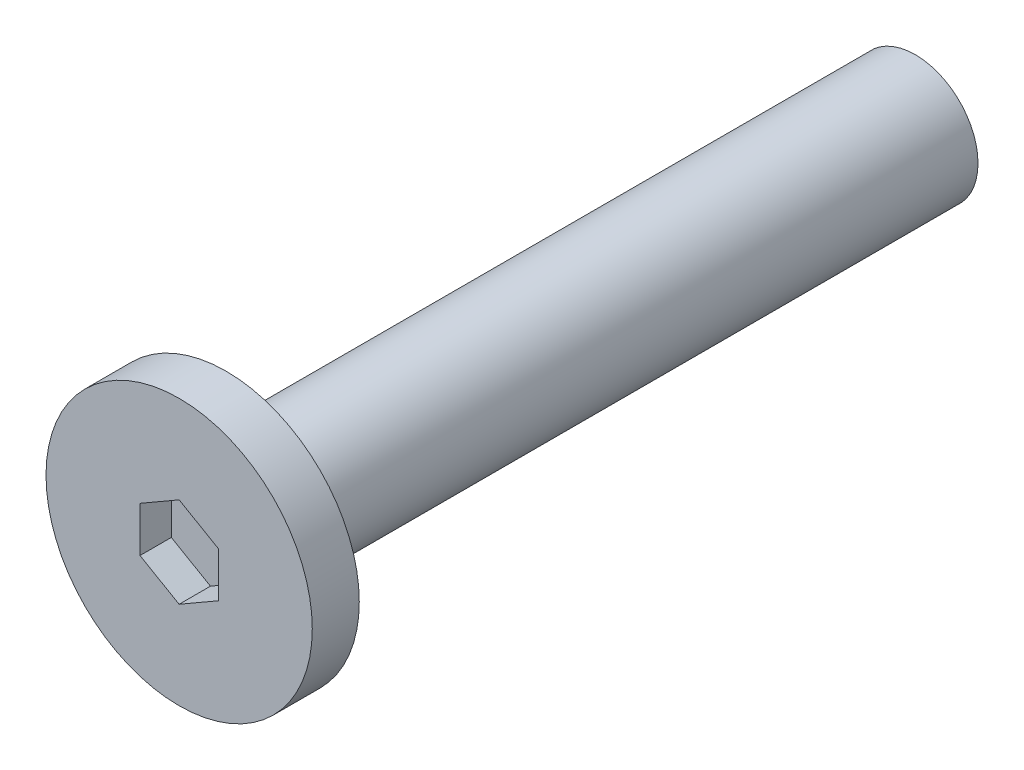
ISO-10303-21;
HEADER;
FILE_DESCRIPTION(('STEP AP214'),'2;1');
FILE_NAME('part.step','',(''),(''),'','','');
FILE_SCHEMA(('AUTOMOTIVE_DESIGN { 1 0 10303 214 1 1 1 1 }'));
ENDSEC;
DATA;
#1=APPLICATION_CONTEXT('core data for automotive mechanical design processes');
#2=APPLICATION_PROTOCOL_DEFINITION('international standard','automotive_design',2000,#1);
#3=PRODUCT_CONTEXT('',#1,'mechanical');
#4=PRODUCT('Part','Part','',(#3));
#5=PRODUCT_RELATED_PRODUCT_CATEGORY('part','',(#4));
#6=PRODUCT_DEFINITION_FORMATION('','',#4);
#7=PRODUCT_DEFINITION_CONTEXT('part definition',#1,'design');
#8=PRODUCT_DEFINITION('design','',#6,#7);
#9=PRODUCT_DEFINITION_SHAPE('','',#8);
#10=(LENGTH_UNIT() NAMED_UNIT(*) SI_UNIT(.MILLI.,.METRE.));
#11=(NAMED_UNIT(*) PLANE_ANGLE_UNIT() SI_UNIT($,.RADIAN.));
#12=(NAMED_UNIT(*) SI_UNIT($,.STERADIAN.) SOLID_ANGLE_UNIT());
#13=UNCERTAINTY_MEASURE_WITH_UNIT(LENGTH_MEASURE(1.E-05),#10,'distance_accuracy_value','');
#14=(GEOMETRIC_REPRESENTATION_CONTEXT(3) GLOBAL_UNCERTAINTY_ASSIGNED_CONTEXT((#13)) GLOBAL_UNIT_ASSIGNED_CONTEXT((#10,
#11,#12)) REPRESENTATION_CONTEXT('',''));
#15=CARTESIAN_POINT('',(0.,0.,0.));
#16=DIRECTION('',(0.,0.,1.));
#17=DIRECTION('',(1.,0.,0.));
#18=AXIS2_PLACEMENT_3D('',#15,#16,#17);
#19=CARTESIAN_POINT('',(21.0196381560285,-172.585838040806,365.074757540733));
#20=DIRECTION('',(0.,0.,1.));
#21=DIRECTION('',(1.,0.,0.));
#22=AXIS2_PLACEMENT_3D('',#19,#20,#21);
#23=PLANE('',#22);
#24=DIRECTION('',(-0.866025403784439,-0.5,0.));
#25=VECTOR('',#24,1.);
#26=CARTESIAN_POINT('',(21.0196381560285,-174.029213713781,365.074757540733));
#27=LINE('',#26,#25);
#28=CARTESIAN_POINT('',(22.2696381560285,-173.307525877294,365.074757540733));
#29=VERTEX_POINT('',#28);
#30=CARTESIAN_POINT('',(21.0196381560285,-174.029213713781,365.074757540733));
#31=VERTEX_POINT('',#30);
#32=EDGE_CURVE('E51',#29,#31,#27,.T.);
#33=ORIENTED_EDGE('',*,*,#32,.F.);
#34=DIRECTION('',(0.,-1.,0.));
#35=VECTOR('',#34,1.);
#36=CARTESIAN_POINT('',(22.2696381560285,-173.307525877294,365.074757540733));
#37=LINE('',#36,#35);
#38=CARTESIAN_POINT('',(22.2696381560285,-171.864150204319,365.074757540733));
#39=VERTEX_POINT('',#38);
#40=EDGE_CURVE('E180',#39,#29,#37,.T.);
#41=ORIENTED_EDGE('',*,*,#40,.F.);
#42=DIRECTION('',(-0.866025403784439,0.5,0.));
#43=VECTOR('',#42,1.);
#44=CARTESIAN_POINT('',(22.2696381560285,-171.864150204319,365.074757540733));
#45=LINE('',#44,#43);
#46=CARTESIAN_POINT('',(21.0196381560285,-171.142462367832,365.074757540733));
#47=VERTEX_POINT('',#46);
#48=EDGE_CURVE('E149',#39,#47,#45,.T.);
#49=ORIENTED_EDGE('',*,*,#48,.T.);
#50=DIRECTION('',(0.866025403784439,0.5,0.));
#51=VECTOR('',#50,1.);
#52=CARTESIAN_POINT('',(21.0196381560285,-171.142462367832,365.074757540733));
#53=LINE('',#52,#51);
#54=CARTESIAN_POINT('',(19.7696381560285,-171.864150204319,365.074757540733));
#55=VERTEX_POINT('',#54);
#56=EDGE_CURVE('E145',#55,#47,#53,.T.);
#57=ORIENTED_EDGE('',*,*,#56,.F.);
#58=DIRECTION('',(0.,-1.,0.));
#59=VECTOR('',#58,1.);
#60=CARTESIAN_POINT('',(19.7696381560285,-171.864150204319,365.074757540733));
#61=LINE('',#60,#59);
#62=CARTESIAN_POINT('',(19.7696381560285,-173.307525877294,365.074757540733));
#63=VERTEX_POINT('',#62);
#64=EDGE_CURVE('E147',#55,#63,#61,.T.);
#65=ORIENTED_EDGE('',*,*,#64,.T.);
#66=DIRECTION('',(-0.866025403784438,0.5,0.));
#67=VECTOR('',#66,1.);
#68=CARTESIAN_POINT('',(19.7696381560285,-173.307525877294,365.074757540733));
#69=LINE('',#68,#67);
#70=EDGE_CURVE('E11',#31,#63,#69,.T.);
#71=ORIENTED_EDGE('',*,*,#70,.F.);
#72=EDGE_LOOP('',(#33,#41,#49,#57,#65,#71));
#73=FACE_BOUND('',#72,.T.);
#74=ADVANCED_FACE('F42',(#73),#23,.T.);
#75=CARTESIAN_POINT('',(19.7696381560285,-173.307525877294,350.874757540733));
#76=DIRECTION('',(0.5,0.866025403784438,0.));
#77=DIRECTION('',(0.,0.,-1.));
#78=AXIS2_PLACEMENT_3D('',#75,#76,#77);
#79=PLANE('',#78);
#80=DIRECTION('',(0.,0.,-1.));
#81=VECTOR('',#80,1.);
#82=CARTESIAN_POINT('',(19.7696381560285,-173.307525877294,350.874757540733));
#83=LINE('',#82,#81);
#84=CARTESIAN_POINT('',(19.7696381560285,-173.307525877294,366.074757540733));
#85=VERTEX_POINT('',#84);
#86=EDGE_CURVE('E136',#85,#63,#83,.T.);
#87=ORIENTED_EDGE('',*,*,#86,.F.);
#88=DIRECTION('',(0.866025403784438,-0.5,0.));
#89=VECTOR('',#88,1.);
#90=CARTESIAN_POINT('',(20.3946381560286,-173.668369795537,366.074757540733));
#91=LINE('',#90,#89);
#92=CARTESIAN_POINT('',(21.0196381560285,-174.029213713781,366.074757540733));
#93=VERTEX_POINT('',#92);
#94=EDGE_CURVE('E184',#85,#93,#91,.T.);
#95=ORIENTED_EDGE('',*,*,#94,.T.);
#96=DIRECTION('',(0.,0.,-1.));
#97=VECTOR('',#96,1.);
#98=CARTESIAN_POINT('',(21.0196381560285,-174.029213713781,350.874757540733));
#99=LINE('',#98,#97);
#100=EDGE_CURVE('E128',#93,#31,#99,.T.);
#101=ORIENTED_EDGE('',*,*,#100,.T.);
#102=ORIENTED_EDGE('',*,*,#70,.T.);
#103=EDGE_LOOP('',(#87,#95,#101,#102));
#104=FACE_BOUND('',#103,.T.);
#105=ADVANCED_FACE('F261',(#104),#79,.T.);
#106=CARTESIAN_POINT('',(21.0196381560285,-174.029213713781,350.874757540733));
#107=DIRECTION('',(-0.5,0.866025403784439,0.));
#108=DIRECTION('',(0.,0.,1.));
#109=AXIS2_PLACEMENT_3D('',#106,#107,#108);
#110=PLANE('',#109);
#111=ORIENTED_EDGE('',*,*,#100,.F.);
#112=DIRECTION('',(0.866025403784439,0.5,0.));
#113=VECTOR('',#112,1.);
#114=CARTESIAN_POINT('',(21.6446381560285,-173.668369795537,366.074757540733));
#115=LINE('',#114,#113);
#116=CARTESIAN_POINT('',(22.2696381560285,-173.307525877294,366.074757540733));
#117=VERTEX_POINT('',#116);
#118=EDGE_CURVE('E194',#93,#117,#115,.T.);
#119=ORIENTED_EDGE('',*,*,#118,.T.);
#120=DIRECTION('',(0.,0.,-1.));
#121=VECTOR('',#120,1.);
#122=CARTESIAN_POINT('',(22.2696381560285,-173.307525877294,350.874757540733));
#123=LINE('',#122,#121);
#124=EDGE_CURVE('E207',#117,#29,#123,.T.);
#125=ORIENTED_EDGE('',*,*,#124,.T.);
#126=ORIENTED_EDGE('',*,*,#32,.T.);
#127=EDGE_LOOP('',(#111,#119,#125,#126));
#128=FACE_BOUND('',#127,.T.);
#129=ADVANCED_FACE('F263',(#128),#110,.T.);
#130=CARTESIAN_POINT('',(22.2696381560285,-173.307525877294,350.874757540733));
#131=DIRECTION('',(-1.,0.,0.));
#132=DIRECTION('',(0.,0.,1.));
#133=AXIS2_PLACEMENT_3D('',#130,#131,#132);
#134=PLANE('',#133);
#135=ORIENTED_EDGE('',*,*,#124,.F.);
#136=DIRECTION('',(0.,1.,0.));
#137=VECTOR('',#136,1.);
#138=CARTESIAN_POINT('',(22.2696381560285,-172.585838040806,366.074757540733));
#139=LINE('',#138,#137);
#140=CARTESIAN_POINT('',(22.2696381560285,-171.864150204319,366.074757540733));
#141=VERTEX_POINT('',#140);
#142=EDGE_CURVE('E197',#117,#141,#139,.T.);
#143=ORIENTED_EDGE('',*,*,#142,.T.);
#144=DIRECTION('',(0.,0.,-1.));
#145=VECTOR('',#144,1.);
#146=CARTESIAN_POINT('',(22.2696381560285,-171.864150204319,350.874757540733));
#147=LINE('',#146,#145);
#148=EDGE_CURVE('E154',#141,#39,#147,.T.);
#149=ORIENTED_EDGE('',*,*,#148,.T.);
#150=ORIENTED_EDGE('',*,*,#40,.T.);
#151=EDGE_LOOP('',(#135,#143,#149,#150));
#152=FACE_BOUND('',#151,.T.);
#153=ADVANCED_FACE('F268',(#152),#134,.T.);
#154=CARTESIAN_POINT('',(22.2696381560285,-171.864150204319,350.874757540733));
#155=DIRECTION('',(-0.5,-0.866025403784439,0.));
#156=DIRECTION('',(-0.866025403784439,0.5,0.));
#157=AXIS2_PLACEMENT_3D('',#154,#155,#156);
#158=PLANE('',#157);
#159=ORIENTED_EDGE('',*,*,#148,.F.);
#160=DIRECTION('',(-0.866025403784439,0.5,0.));
#161=VECTOR('',#160,1.);
#162=CARTESIAN_POINT('',(21.6446381560285,-171.503306286076,366.074757540733));
#163=LINE('',#162,#161);
#164=CARTESIAN_POINT('',(21.0196381560285,-171.142462367832,366.074757540733));
#165=VERTEX_POINT('',#164);
#166=EDGE_CURVE('E193',#141,#165,#163,.T.);
#167=ORIENTED_EDGE('',*,*,#166,.T.);
#168=DIRECTION('',(0.,0.,-1.));
#169=VECTOR('',#168,1.);
#170=CARTESIAN_POINT('',(21.0196381560285,-171.142462367832,350.874757540733));
#171=LINE('',#170,#169);
#172=EDGE_CURVE('E155',#165,#47,#171,.T.);
#173=ORIENTED_EDGE('',*,*,#172,.T.);
#174=ORIENTED_EDGE('',*,*,#48,.F.);
#175=EDGE_LOOP('',(#159,#167,#173,#174));
#176=FACE_BOUND('',#175,.T.);
#177=ADVANCED_FACE('F229',(#176),#158,.T.);
#178=CARTESIAN_POINT('',(21.0196381560285,-171.142462367832,350.874757540733));
#179=DIRECTION('',(0.5,-0.866025403784439,0.));
#180=DIRECTION('',(0.,0.,-1.));
#181=AXIS2_PLACEMENT_3D('',#178,#179,#180);
#182=PLANE('',#181);
#183=ORIENTED_EDGE('',*,*,#172,.F.);
#184=DIRECTION('',(-0.866025403784439,-0.5,0.));
#185=VECTOR('',#184,1.);
#186=CARTESIAN_POINT('',(20.3946381560286,-171.503306286076,366.074757540733));
#187=LINE('',#186,#185);
#188=CARTESIAN_POINT('',(19.7696381560285,-171.864150204319,366.074757540733));
#189=VERTEX_POINT('',#188);
#190=EDGE_CURVE('E167',#165,#189,#187,.T.);
#191=ORIENTED_EDGE('',*,*,#190,.T.);
#192=DIRECTION('',(0.,0.,-1.));
#193=VECTOR('',#192,1.);
#194=CARTESIAN_POINT('',(19.7696381560285,-171.864150204319,350.874757540733));
#195=LINE('',#194,#193);
#196=EDGE_CURVE('E160',#189,#55,#195,.T.);
#197=ORIENTED_EDGE('',*,*,#196,.T.);
#198=ORIENTED_EDGE('',*,*,#56,.T.);
#199=EDGE_LOOP('',(#183,#191,#197,#198));
#200=FACE_BOUND('',#199,.T.);
#201=ADVANCED_FACE('F165',(#200),#182,.T.);
#202=CARTESIAN_POINT('',(19.7696381560285,-171.864150204319,350.874757540733));
#203=DIRECTION('',(1.,0.,0.));
#204=DIRECTION('',(0.,1.,0.));
#205=AXIS2_PLACEMENT_3D('',#202,#203,#204);
#206=PLANE('',#205);
#207=ORIENTED_EDGE('',*,*,#196,.F.);
#208=DIRECTION('',(0.,-1.,0.));
#209=VECTOR('',#208,1.);
#210=CARTESIAN_POINT('',(19.7696381560285,-172.585838040806,366.074757540733));
#211=LINE('',#210,#209);
#212=EDGE_CURVE('E182',#189,#85,#211,.T.);
#213=ORIENTED_EDGE('',*,*,#212,.T.);
#214=ORIENTED_EDGE('',*,*,#86,.T.);
#215=ORIENTED_EDGE('',*,*,#64,.F.);
#216=EDGE_LOOP('',(#207,#213,#214,#215));
#217=FACE_BOUND('',#216,.T.);
#218=ADVANCED_FACE('F159',(#217),#206,.T.);
#219=CARTESIAN_POINT('',(21.0196381560285,-172.585838040806,364.574757540733));
#220=DIRECTION('',(0.,0.,1.));
#221=DIRECTION('',(1.,0.,0.));
#222=AXIS2_PLACEMENT_3D('',#219,#220,#221);
#223=PLANE('',#222);
#224=CARTESIAN_POINT('',(21.0196381560285,-172.585838040806,364.574757540733));
#225=DIRECTION('',(0.,0.,-1.));
#226=DIRECTION('',(-1.,0.,0.));
#227=AXIS2_PLACEMENT_3D('',#224,#225,#226);
#228=CIRCLE('',#227,4.25);
#229=CARTESIAN_POINT('',(16.7696381560285,-172.585838040806,364.574757540733));
#230=VERTEX_POINT('',#229);
#231=EDGE_CURVE('E169',#230,#230,#228,.T.);
#232=ORIENTED_EDGE('',*,*,#231,.T.);
#233=EDGE_LOOP('',(#232));
#234=FACE_BOUND('',#233,.T.);
#235=CARTESIAN_POINT('',(21.0196381560285,-172.585838040806,364.574757540733));
#236=DIRECTION('',(0.,0.,1.));
#237=DIRECTION('',(-1.,0.,0.));
#238=AXIS2_PLACEMENT_3D('',#235,#236,#237);
#239=CIRCLE('',#238,2.);
#240=CARTESIAN_POINT('',(19.0196381560285,-172.585838040806,364.574757540733));
#241=VERTEX_POINT('',#240);
#242=EDGE_CURVE('E200',#241,#241,#239,.T.);
#243=ORIENTED_EDGE('',*,*,#242,.T.);
#244=EDGE_LOOP('',(#243));
#245=FACE_BOUND('',#244,.T.);
#246=ADVANCED_FACE('F271',(#234,#245),#223,.F.);
#247=CARTESIAN_POINT('',(21.0196381560285,-172.585838040806,364.574757540733));
#248=DIRECTION('',(0.,0.,1.));
#249=DIRECTION('',(-1.,0.,0.));
#250=AXIS2_PLACEMENT_3D('',#247,#248,#249);
#251=CYLINDRICAL_SURFACE('',#250,4.25);
#252=CARTESIAN_POINT('',(21.0196381560285,-172.585838040806,366.074757540733));
#253=DIRECTION('',(0.,0.,-1.));
#254=DIRECTION('',(-1.,0.,0.));
#255=AXIS2_PLACEMENT_3D('',#252,#253,#254);
#256=CIRCLE('',#255,4.25);
#257=CARTESIAN_POINT('',(16.7696381560285,-172.585838040806,366.074757540733));
#258=VERTEX_POINT('',#257);
#259=EDGE_CURVE('E188',#258,#258,#256,.T.);
#260=ORIENTED_EDGE('',*,*,#259,.T.);
#261=EDGE_LOOP('',(#260));
#262=FACE_BOUND('',#261,.T.);
#263=ORIENTED_EDGE('',*,*,#231,.F.);
#264=EDGE_LOOP('',(#263));
#265=FACE_BOUND('',#264,.T.);
#266=ADVANCED_FACE('F274',(#262,#265),#251,.T.);
#267=CARTESIAN_POINT('',(21.0196381560284,-172.585838040806,359.074757540733));
#268=DIRECTION('',(0.,0.,1.));
#269=DIRECTION('',(1.,0.,0.));
#270=AXIS2_PLACEMENT_3D('',#267,#268,#269);
#271=PLANE('',#270);
#272=CARTESIAN_POINT('',(21.0196381560284,-172.585838040806,359.074757540733));
#273=DIRECTION('',(0.,0.,1.));
#274=DIRECTION('',(-1.,0.,0.));
#275=AXIS2_PLACEMENT_3D('',#272,#273,#274);
#276=CIRCLE('',#275,1.5);
#277=CARTESIAN_POINT('',(19.5196381560284,-172.585838040806,359.074757540733));
#278=VERTEX_POINT('',#277);
#279=EDGE_CURVE('E100',#278,#278,#276,.T.);
#280=ORIENTED_EDGE('',*,*,#279,.F.);
#281=EDGE_LOOP('',(#280));
#282=FACE_BOUND('',#281,.T.);
#283=ADVANCED_FACE('F283',(#282),#271,.F.);
#284=CARTESIAN_POINT('',(21.0196381560284,-172.585838040806,364.074757540733));
#285=DIRECTION('',(0.,0.,-1.));
#286=DIRECTION('',(1.,0.,0.));
#287=AXIS2_PLACEMENT_3D('',#284,#285,#286);
#288=CYLINDRICAL_SURFACE('',#287,1.5);
#289=CARTESIAN_POINT('',(21.0196381560285,-172.585838040806,342.574757540733));
#290=DIRECTION('',(0.,0.,1.));
#291=DIRECTION('',(1.,0.,0.));
#292=AXIS2_PLACEMENT_3D('',#289,#290,#291);
#293=CIRCLE('',#292,1.5);
#294=CARTESIAN_POINT('',(22.5196381560285,-172.585838040806,342.574757540733));
#295=VERTEX_POINT('',#294);
#296=EDGE_CURVE('E90',#295,#295,#293,.T.);
#297=ORIENTED_EDGE('',*,*,#296,.F.);
#298=EDGE_LOOP('',(#297));
#299=FACE_BOUND('',#298,.T.);
#300=ORIENTED_EDGE('',*,*,#279,.T.);
#301=EDGE_LOOP('',(#300));
#302=FACE_BOUND('',#301,.T.);
#303=ADVANCED_FACE('F286',(#299,#302),#288,.F.);
#304=CARTESIAN_POINT('',(21.0196381560286,-172.585838040806,342.574757540733));
#305=DIRECTION('',(0.,0.,-1.));
#306=DIRECTION('',(0.,-1.,0.));
#307=AXIS2_PLACEMENT_3D('',#304,#305,#306);
#308=PLANE('',#307);
#309=CARTESIAN_POINT('',(21.0196381560285,-172.585838040806,342.574757540733));
#310=DIRECTION('',(0.,0.,-1.));
#311=DIRECTION('',(1.,0.,0.));
#312=AXIS2_PLACEMENT_3D('',#309,#310,#311);
#313=CIRCLE('',#312,2.);
#314=CARTESIAN_POINT('',(23.0196381560285,-172.585838040806,342.574757540733));
#315=VERTEX_POINT('',#314);
#316=EDGE_CURVE('E183',#315,#315,#313,.T.);
#317=ORIENTED_EDGE('',*,*,#316,.T.);
#318=EDGE_LOOP('',(#317));
#319=FACE_BOUND('',#318,.T.);
#320=ORIENTED_EDGE('',*,*,#296,.T.);
#321=EDGE_LOOP('',(#320));
#322=FACE_BOUND('',#321,.T.);
#323=ADVANCED_FACE('F279',(#319,#322),#308,.T.);
#324=CARTESIAN_POINT('',(21.0196381560285,-172.585838040806,356.074757540733));
#325=DIRECTION('',(0.,0.,1.));
#326=DIRECTION('',(-1.,0.,0.));
#327=AXIS2_PLACEMENT_3D('',#324,#325,#326);
#328=CYLINDRICAL_SURFACE('',#327,2.);
#329=ORIENTED_EDGE('',*,*,#242,.F.);
#330=EDGE_LOOP('',(#329));
#331=FACE_BOUND('',#330,.T.);
#332=ORIENTED_EDGE('',*,*,#316,.F.);
#333=EDGE_LOOP('',(#332));
#334=FACE_BOUND('',#333,.T.);
#335=ADVANCED_FACE('F276',(#331,#334),#328,.T.);
#336=CARTESIAN_POINT('',(21.0196381560285,-172.585838040806,366.074757540733));
#337=DIRECTION('',(0.,0.,1.));
#338=DIRECTION('',(1.,0.,0.));
#339=AXIS2_PLACEMENT_3D('',#336,#337,#338);
#340=PLANE('',#339);
#341=ORIENTED_EDGE('',*,*,#190,.F.);
#342=ORIENTED_EDGE('',*,*,#166,.F.);
#343=ORIENTED_EDGE('',*,*,#142,.F.);
#344=ORIENTED_EDGE('',*,*,#118,.F.);
#345=ORIENTED_EDGE('',*,*,#94,.F.);
#346=ORIENTED_EDGE('',*,*,#212,.F.);
#347=EDGE_LOOP('',(#341,#342,#343,#344,#345,#346));
#348=FACE_BOUND('',#347,.T.);
#349=ORIENTED_EDGE('',*,*,#259,.F.);
#350=EDGE_LOOP('',(#349));
#351=FACE_BOUND('',#350,.T.);
#352=ADVANCED_FACE('F235',(#348,#351),#340,.T.);
#353=CLOSED_SHELL('',(#74,#105,#129,#153,#177,#201,#218,#246,#266,#283,#303,#323,#335,#352));
#354=MANIFOLD_SOLID_BREP('B2',#353);
#355=ADVANCED_BREP_SHAPE_REPRESENTATION('',(#18,#354),#14);
#356=SHAPE_DEFINITION_REPRESENTATION(#9,#355);
ENDSEC;
END-ISO-10303-21;
